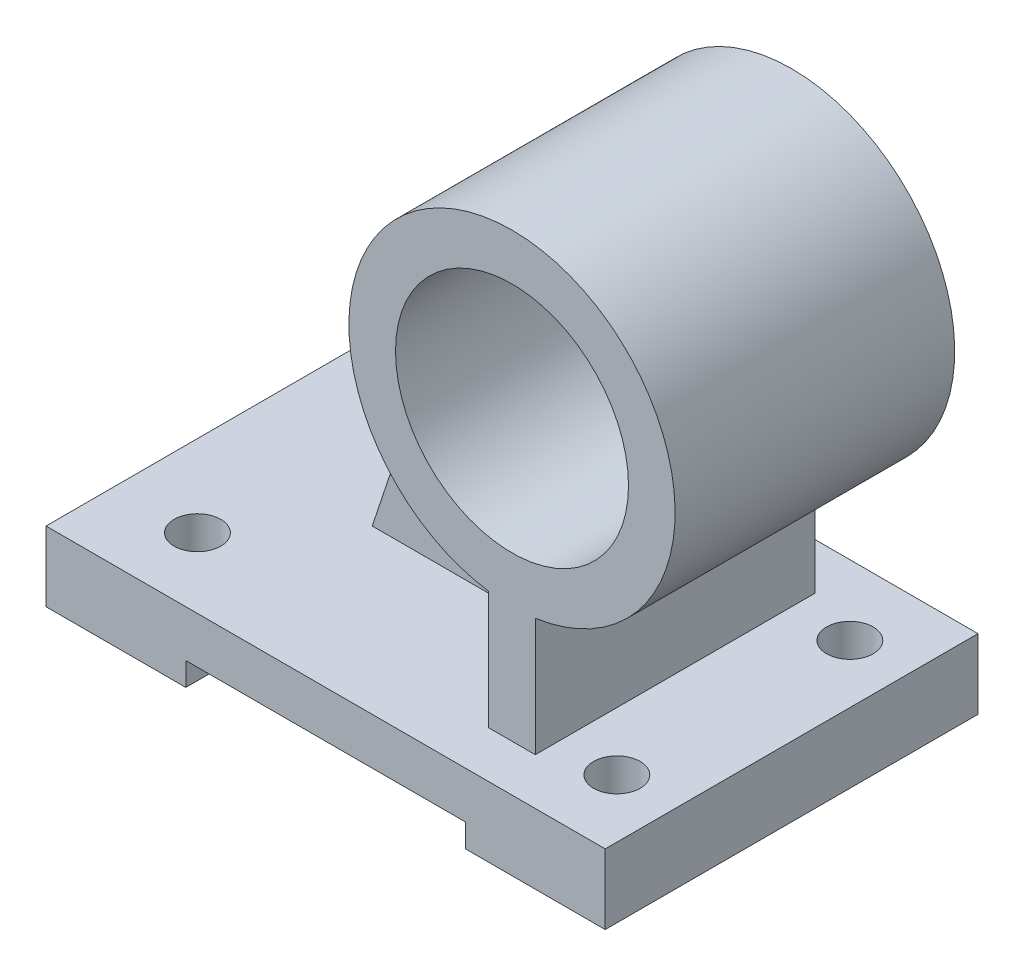
ISO-10303-21;
HEADER;
FILE_DESCRIPTION(('STEP AP214'),'2;1');
FILE_NAME('part.step','',(''),(''),'','','');
FILE_SCHEMA(('AUTOMOTIVE_DESIGN { 1 0 10303 214 1 1 1 1 }'));
ENDSEC;
DATA;
#1=APPLICATION_CONTEXT('core data for automotive mechanical design processes');
#2=APPLICATION_PROTOCOL_DEFINITION('international standard','automotive_design',2000,#1);
#3=PRODUCT_CONTEXT('',#1,'mechanical');
#4=PRODUCT('Part','Part','',(#3));
#5=PRODUCT_RELATED_PRODUCT_CATEGORY('part','',(#4));
#6=PRODUCT_DEFINITION_FORMATION('','',#4);
#7=PRODUCT_DEFINITION_CONTEXT('part definition',#1,'design');
#8=PRODUCT_DEFINITION('design','',#6,#7);
#9=PRODUCT_DEFINITION_SHAPE('','',#8);
#10=(LENGTH_UNIT() NAMED_UNIT(*) SI_UNIT(.MILLI.,.METRE.));
#11=(NAMED_UNIT(*) PLANE_ANGLE_UNIT() SI_UNIT($,.RADIAN.));
#12=(NAMED_UNIT(*) SI_UNIT($,.STERADIAN.) SOLID_ANGLE_UNIT());
#13=UNCERTAINTY_MEASURE_WITH_UNIT(LENGTH_MEASURE(1.E-05),#10,'distance_accuracy_value','');
#14=(GEOMETRIC_REPRESENTATION_CONTEXT(3) GLOBAL_UNCERTAINTY_ASSIGNED_CONTEXT((#13)) GLOBAL_UNIT_ASSIGNED_CONTEXT((#10,
#11,#12)) REPRESENTATION_CONTEXT('',''));
#15=CARTESIAN_POINT('',(0.,0.,0.));
#16=DIRECTION('',(0.,0.,1.));
#17=DIRECTION('',(1.,0.,0.));
#18=AXIS2_PLACEMENT_3D('',#15,#16,#17);
#19=CARTESIAN_POINT('',(0.,0.,-30.));
#20=DIRECTION('',(0.,0.,1.));
#21=DIRECTION('',(1.,0.,0.));
#22=AXIS2_PLACEMENT_3D('',#19,#20,#21);
#23=CYLINDRICAL_SURFACE('',#22,35.);
#24=DIRECTION('',(0.,0.,1.));
#25=VECTOR('',#24,1.);
#26=CARTESIAN_POINT('',(-4.99999999999999,-34.6410161513776,-30.));
#27=LINE('',#26,#25);
#28=CARTESIAN_POINT('',(-4.99999999999999,-34.6410161513776,-30.));
#29=VERTEX_POINT('',#28);
#30=CARTESIAN_POINT('',(-4.99999999999999,-34.6410161513776,-5.));
#31=VERTEX_POINT('',#30);
#32=EDGE_CURVE('E288',#29,#31,#27,.T.);
#33=ORIENTED_EDGE('',*,*,#32,.T.);
#34=CARTESIAN_POINT('',(0.,0.,-5.));
#35=DIRECTION('',(0.,0.,1.));
#36=DIRECTION('',(1.,0.,0.));
#37=AXIS2_PLACEMENT_3D('',#34,#35,#36);
#38=CIRCLE('',#37,35.);
#39=CARTESIAN_POINT('',(-35.,0.,-5.));
#40=VERTEX_POINT('',#39);
#41=EDGE_CURVE('E239',#40,#31,#38,.T.);
#42=ORIENTED_EDGE('',*,*,#41,.F.);
#43=DIRECTION('',(0.,0.,1.));
#44=VECTOR('',#43,1.);
#45=CARTESIAN_POINT('',(-35.,0.,-5.));
#46=LINE('',#45,#44);
#47=CARTESIAN_POINT('',(-35.,0.,5.));
#48=VERTEX_POINT('',#47);
#49=EDGE_CURVE('E249',#40,#48,#46,.T.);
#50=ORIENTED_EDGE('',*,*,#49,.T.);
#51=CARTESIAN_POINT('',(0.,0.,5.));
#52=DIRECTION('',(0.,0.,1.));
#53=DIRECTION('',(1.,0.,0.));
#54=AXIS2_PLACEMENT_3D('',#51,#52,#53);
#55=CIRCLE('',#54,35.);
#56=CARTESIAN_POINT('',(-4.99999999999999,-34.6410161513776,5.));
#57=VERTEX_POINT('',#56);
#58=EDGE_CURVE('E220',#48,#57,#55,.T.);
#59=ORIENTED_EDGE('',*,*,#58,.T.);
#60=CARTESIAN_POINT('',(-4.99999999999999,-34.6410161513776,30.));
#61=VERTEX_POINT('',#60);
#62=EDGE_CURVE('E280',#57,#61,#27,.T.);
#63=ORIENTED_EDGE('',*,*,#62,.T.);
#64=CARTESIAN_POINT('',(0.,0.,30.));
#65=DIRECTION('',(0.,0.,1.));
#66=DIRECTION('',(1.,0.,0.));
#67=AXIS2_PLACEMENT_3D('',#64,#65,#66);
#68=CIRCLE('',#67,35.);
#69=CARTESIAN_POINT('',(5.00000000000001,-34.6410161513776,30.));
#70=VERTEX_POINT('',#69);
#71=EDGE_CURVE('E257',#70,#61,#68,.T.);
#72=ORIENTED_EDGE('',*,*,#71,.F.);
#73=DIRECTION('',(0.,0.,1.));
#74=VECTOR('',#73,1.);
#75=CARTESIAN_POINT('',(5.00000000000001,-34.6410161513776,-30.));
#76=LINE('',#75,#74);
#77=CARTESIAN_POINT('',(5.00000000000001,-34.6410161513776,-30.));
#78=VERTEX_POINT('',#77);
#79=EDGE_CURVE('E11',#78,#70,#76,.T.);
#80=ORIENTED_EDGE('',*,*,#79,.F.);
#81=CARTESIAN_POINT('',(0.,0.,-30.));
#82=DIRECTION('',(0.,0.,1.));
#83=DIRECTION('',(1.,0.,0.));
#84=AXIS2_PLACEMENT_3D('',#81,#82,#83);
#85=CIRCLE('',#84,35.);
#86=EDGE_CURVE('E271',#78,#29,#85,.T.);
#87=ORIENTED_EDGE('',*,*,#86,.T.);
#88=EDGE_LOOP('',(#33,#42,#50,#59,#63,#72,#80,#87));
#89=FACE_BOUND('',#88,.T.);
#90=ADVANCED_FACE('F39',(#89),#23,.T.);
#91=CARTESIAN_POINT('',(-4.99999999999999,0.,-30.));
#92=DIRECTION('',(1.,0.,0.));
#93=DIRECTION('',(0.,1.,0.));
#94=AXIS2_PLACEMENT_3D('',#91,#92,#93);
#95=PLANE('',#94);
#96=DIRECTION('',(0.,1.,0.));
#97=VECTOR('',#96,1.);
#98=CARTESIAN_POINT('',(-4.99999999999999,0.,-5.));
#99=LINE('',#98,#97);
#100=CARTESIAN_POINT('',(-4.99999999999999,-60.,-5.));
#101=VERTEX_POINT('',#100);
#102=EDGE_CURVE('E246',#101,#31,#99,.T.);
#103=ORIENTED_EDGE('',*,*,#102,.T.);
#104=ORIENTED_EDGE('',*,*,#32,.F.);
#105=DIRECTION('',(0.,1.,0.));
#106=VECTOR('',#105,1.);
#107=CARTESIAN_POINT('',(-4.99999999999999,0.,-30.));
#108=LINE('',#107,#106);
#109=CARTESIAN_POINT('',(-4.99999999999999,-60.,-30.));
#110=VERTEX_POINT('',#109);
#111=EDGE_CURVE('E273',#110,#29,#108,.T.);
#112=ORIENTED_EDGE('',*,*,#111,.F.);
#113=DIRECTION('',(0.,0.,1.));
#114=VECTOR('',#113,1.);
#115=CARTESIAN_POINT('',(-4.99999999999999,-60.,-30.));
#116=LINE('',#115,#114);
#117=EDGE_CURVE('E284',#110,#101,#116,.T.);
#118=ORIENTED_EDGE('',*,*,#117,.T.);
#119=EDGE_LOOP('',(#103,#104,#112,#118));
#120=FACE_BOUND('',#119,.T.);
#121=ADVANCED_FACE('F341',(#120),#95,.F.);
#122=CARTESIAN_POINT('',(5.00000000000001,0.,-30.));
#123=DIRECTION('',(1.,0.,0.));
#124=DIRECTION('',(0.,1.,0.));
#125=AXIS2_PLACEMENT_3D('',#122,#123,#124);
#126=PLANE('',#125);
#127=ORIENTED_EDGE('',*,*,#79,.T.);
#128=DIRECTION('',(0.,1.,0.));
#129=VECTOR('',#128,1.);
#130=CARTESIAN_POINT('',(5.00000000000001,0.,30.));
#131=LINE('',#130,#129);
#132=CARTESIAN_POINT('',(5.00000000000001,-60.,30.));
#133=VERTEX_POINT('',#132);
#134=EDGE_CURVE('E265',#133,#70,#131,.T.);
#135=ORIENTED_EDGE('',*,*,#134,.F.);
#136=DIRECTION('',(0.,0.,1.));
#137=VECTOR('',#136,1.);
#138=CARTESIAN_POINT('',(5.00000000000001,-60.,-30.));
#139=LINE('',#138,#137);
#140=CARTESIAN_POINT('',(5.00000000000001,-60.,-30.));
#141=VERTEX_POINT('',#140);
#142=EDGE_CURVE('E48',#141,#133,#139,.T.);
#143=ORIENTED_EDGE('',*,*,#142,.F.);
#144=DIRECTION('',(0.,1.,0.));
#145=VECTOR('',#144,1.);
#146=CARTESIAN_POINT('',(5.00000000000001,0.,-30.));
#147=LINE('',#146,#145);
#148=EDGE_CURVE('E278',#141,#78,#147,.T.);
#149=ORIENTED_EDGE('',*,*,#148,.T.);
#150=EDGE_LOOP('',(#127,#135,#143,#149));
#151=FACE_BOUND('',#150,.T.);
#152=ADVANCED_FACE('F346',(#151),#126,.T.);
#153=CARTESIAN_POINT('',(0.,0.,-30.));
#154=DIRECTION('',(0.,0.,1.));
#155=DIRECTION('',(1.,0.,0.));
#156=AXIS2_PLACEMENT_3D('',#153,#154,#155);
#157=CYLINDRICAL_SURFACE('',#156,25.);
#158=CARTESIAN_POINT('',(0.,0.,-30.));
#159=DIRECTION('',(0.,0.,1.));
#160=DIRECTION('',(1.,0.,0.));
#161=AXIS2_PLACEMENT_3D('',#158,#159,#160);
#162=CIRCLE('',#161,25.);
#163=CARTESIAN_POINT('',(25.,0.,-30.));
#164=VERTEX_POINT('',#163);
#165=EDGE_CURVE('E268',#164,#164,#162,.T.);
#166=ORIENTED_EDGE('',*,*,#165,.F.);
#167=EDGE_LOOP('',(#166));
#168=FACE_BOUND('',#167,.T.);
#169=CARTESIAN_POINT('',(0.,0.,30.));
#170=DIRECTION('',(0.,0.,1.));
#171=DIRECTION('',(1.,0.,0.));
#172=AXIS2_PLACEMENT_3D('',#169,#170,#171);
#173=CIRCLE('',#172,25.);
#174=CARTESIAN_POINT('',(25.,0.,30.));
#175=VERTEX_POINT('',#174);
#176=EDGE_CURVE('E252',#175,#175,#173,.T.);
#177=ORIENTED_EDGE('',*,*,#176,.T.);
#178=EDGE_LOOP('',(#177));
#179=FACE_BOUND('',#178,.T.);
#180=ADVANCED_FACE('F41',(#168,#179),#157,.F.);
#181=ORIENTED_EDGE('',*,*,#62,.F.);
#182=DIRECTION('',(0.,1.,0.));
#183=VECTOR('',#182,1.);
#184=CARTESIAN_POINT('',(-4.99999999999999,0.,5.));
#185=LINE('',#184,#183);
#186=CARTESIAN_POINT('',(-4.99999999999999,-60.,5.));
#187=VERTEX_POINT('',#186);
#188=EDGE_CURVE('E237',#187,#57,#185,.T.);
#189=ORIENTED_EDGE('',*,*,#188,.F.);
#190=CARTESIAN_POINT('',(-4.99999999999999,-60.,30.));
#191=VERTEX_POINT('',#190);
#192=EDGE_CURVE('E287',#187,#191,#116,.T.);
#193=ORIENTED_EDGE('',*,*,#192,.T.);
#194=DIRECTION('',(0.,1.,0.));
#195=VECTOR('',#194,1.);
#196=CARTESIAN_POINT('',(-4.99999999999999,0.,30.));
#197=LINE('',#196,#195);
#198=EDGE_CURVE('E260',#191,#61,#197,.T.);
#199=ORIENTED_EDGE('',*,*,#198,.T.);
#200=EDGE_LOOP('',(#181,#189,#193,#199));
#201=FACE_BOUND('',#200,.T.);
#202=ADVANCED_FACE('F349',(#201),#95,.F.);
#203=CARTESIAN_POINT('',(0.,0.,-30.));
#204=DIRECTION('',(0.,0.,1.));
#205=DIRECTION('',(1.,0.,0.));
#206=AXIS2_PLACEMENT_3D('',#203,#204,#205);
#207=PLANE('',#206);
#208=ORIENTED_EDGE('',*,*,#165,.T.);
#209=EDGE_LOOP('',(#208));
#210=FACE_BOUND('',#209,.T.);
#211=ORIENTED_EDGE('',*,*,#86,.F.);
#212=ORIENTED_EDGE('',*,*,#148,.F.);
#213=DIRECTION('',(1.,0.,0.));
#214=VECTOR('',#213,1.);
#215=CARTESIAN_POINT('',(0.,-60.,-30.));
#216=LINE('',#215,#214);
#217=EDGE_CURVE('E275',#110,#141,#216,.T.);
#218=ORIENTED_EDGE('',*,*,#217,.F.);
#219=ORIENTED_EDGE('',*,*,#111,.T.);
#220=EDGE_LOOP('',(#211,#212,#218,#219));
#221=FACE_BOUND('',#220,.T.);
#222=ADVANCED_FACE('F352',(#210,#221),#207,.F.);
#223=CARTESIAN_POINT('',(0.,0.,30.));
#224=DIRECTION('',(0.,0.,1.));
#225=DIRECTION('',(1.,0.,0.));
#226=AXIS2_PLACEMENT_3D('',#223,#224,#225);
#227=PLANE('',#226);
#228=ORIENTED_EDGE('',*,*,#176,.F.);
#229=EDGE_LOOP('',(#228));
#230=FACE_BOUND('',#229,.T.);
#231=ORIENTED_EDGE('',*,*,#71,.T.);
#232=ORIENTED_EDGE('',*,*,#198,.F.);
#233=DIRECTION('',(1.,0.,0.));
#234=VECTOR('',#233,1.);
#235=CARTESIAN_POINT('',(0.,-60.,30.));
#236=LINE('',#235,#234);
#237=EDGE_CURVE('E263',#191,#133,#236,.T.);
#238=ORIENTED_EDGE('',*,*,#237,.T.);
#239=ORIENTED_EDGE('',*,*,#134,.T.);
#240=EDGE_LOOP('',(#231,#232,#238,#239));
#241=FACE_BOUND('',#240,.T.);
#242=ADVANCED_FACE('F359',(#230,#241),#227,.T.);
#243=CARTESIAN_POINT('',(-31.5,10.5,-5.));
#244=DIRECTION('',(-0.948683298050514,0.316227766016838,0.));
#245=DIRECTION('',(-0.316227766016838,-0.948683298050514,0.));
#246=AXIS2_PLACEMENT_3D('',#243,#244,#245);
#247=PLANE('',#246);
#248=DIRECTION('',(0.,0.,1.));
#249=VECTOR('',#248,1.);
#250=CARTESIAN_POINT('',(-55.,-60.,-5.));
#251=LINE('',#250,#249);
#252=CARTESIAN_POINT('',(-55.,-60.,-5.));
#253=VERTEX_POINT('',#252);
#254=CARTESIAN_POINT('',(-55.,-60.,5.));
#255=VERTEX_POINT('',#254);
#256=EDGE_CURVE('E250',#253,#255,#251,.T.);
#257=ORIENTED_EDGE('',*,*,#256,.T.);
#258=DIRECTION('',(-0.316227766016838,-0.948683298050514,0.));
#259=VECTOR('',#258,1.);
#260=CARTESIAN_POINT('',(-31.5,10.5,5.));
#261=LINE('',#260,#259);
#262=EDGE_CURVE('E234',#48,#255,#261,.T.);
#263=ORIENTED_EDGE('',*,*,#262,.F.);
#264=ORIENTED_EDGE('',*,*,#49,.F.);
#265=DIRECTION('',(-0.316227766016838,-0.948683298050514,0.));
#266=VECTOR('',#265,1.);
#267=CARTESIAN_POINT('',(-31.5,10.5,-5.));
#268=LINE('',#267,#266);
#269=EDGE_CURVE('E241',#40,#253,#268,.T.);
#270=ORIENTED_EDGE('',*,*,#269,.T.);
#271=EDGE_LOOP('',(#257,#263,#264,#270));
#272=FACE_BOUND('',#271,.T.);
#273=ADVANCED_FACE('F363',(#272),#247,.T.);
#274=CARTESIAN_POINT('',(0.,0.,-5.));
#275=DIRECTION('',(0.,0.,1.));
#276=DIRECTION('',(1.,0.,0.));
#277=AXIS2_PLACEMENT_3D('',#274,#275,#276);
#278=PLANE('',#277);
#279=ORIENTED_EDGE('',*,*,#41,.T.);
#280=ORIENTED_EDGE('',*,*,#102,.F.);
#281=DIRECTION('',(-1.,0.,0.));
#282=VECTOR('',#281,1.);
#283=CARTESIAN_POINT('',(0.,-60.,-5.));
#284=LINE('',#283,#282);
#285=EDGE_CURVE('E244',#101,#253,#284,.T.);
#286=ORIENTED_EDGE('',*,*,#285,.T.);
#287=ORIENTED_EDGE('',*,*,#269,.F.);
#288=EDGE_LOOP('',(#279,#280,#286,#287));
#289=FACE_BOUND('',#288,.T.);
#290=ADVANCED_FACE('F367',(#289),#278,.F.);
#291=CARTESIAN_POINT('',(0.,0.,5.));
#292=DIRECTION('',(0.,0.,1.));
#293=DIRECTION('',(1.,0.,0.));
#294=AXIS2_PLACEMENT_3D('',#291,#292,#293);
#295=PLANE('',#294);
#296=ORIENTED_EDGE('',*,*,#58,.F.);
#297=ORIENTED_EDGE('',*,*,#262,.T.);
#298=DIRECTION('',(-1.,0.,0.));
#299=VECTOR('',#298,1.);
#300=CARTESIAN_POINT('',(0.,-60.,5.));
#301=LINE('',#300,#299);
#302=EDGE_CURVE('E56',#187,#255,#301,.T.);
#303=ORIENTED_EDGE('',*,*,#302,.F.);
#304=ORIENTED_EDGE('',*,*,#188,.T.);
#305=EDGE_LOOP('',(#296,#297,#303,#304));
#306=FACE_BOUND('',#305,.T.);
#307=ADVANCED_FACE('F371',(#306),#295,.T.);
#308=CARTESIAN_POINT('',(0.,-60.,-40.));
#309=DIRECTION('',(0.,-1.,0.));
#310=DIRECTION('',(0.,0.,-1.));
#311=AXIS2_PLACEMENT_3D('',#308,#309,#310);
#312=PLANE('',#311);
#313=CARTESIAN_POINT('',(17.5000000000005,-60.,25.));
#314=DIRECTION('',(0.,1.,0.));
#315=DIRECTION('',(0.,0.,1.));
#316=AXIS2_PLACEMENT_3D('',#313,#314,#315);
#317=CIRCLE('',#316,5.);
#318=CARTESIAN_POINT('',(17.5000000000005,-60.,30.));
#319=VERTEX_POINT('',#318);
#320=EDGE_CURVE('E389',#319,#319,#317,.T.);
#321=ORIENTED_EDGE('',*,*,#320,.F.);
#322=EDGE_LOOP('',(#321));
#323=FACE_BOUND('',#322,.T.);
#324=CARTESIAN_POINT('',(17.5,-60.,-25.));
#325=DIRECTION('',(0.,1.,0.));
#326=DIRECTION('',(0.,0.,1.));
#327=AXIS2_PLACEMENT_3D('',#324,#325,#326);
#328=CIRCLE('',#327,5.);
#329=CARTESIAN_POINT('',(17.5,-60.,-20.));
#330=VERTEX_POINT('',#329);
#331=EDGE_CURVE('E393',#330,#330,#328,.T.);
#332=ORIENTED_EDGE('',*,*,#331,.F.);
#333=EDGE_LOOP('',(#332));
#334=FACE_BOUND('',#333,.T.);
#335=CARTESIAN_POINT('',(-72.5,-60.,-25.));
#336=DIRECTION('',(0.,1.,0.));
#337=DIRECTION('',(0.,0.,1.));
#338=AXIS2_PLACEMENT_3D('',#335,#336,#337);
#339=CIRCLE('',#338,5.);
#340=CARTESIAN_POINT('',(-72.5,-60.,-20.));
#341=VERTEX_POINT('',#340);
#342=EDGE_CURVE('E397',#341,#341,#339,.T.);
#343=ORIENTED_EDGE('',*,*,#342,.F.);
#344=EDGE_LOOP('',(#343));
#345=FACE_BOUND('',#344,.T.);
#346=CARTESIAN_POINT('',(-72.4999999999995,-60.,25.));
#347=DIRECTION('',(0.,1.,0.));
#348=DIRECTION('',(0.,0.,1.));
#349=AXIS2_PLACEMENT_3D('',#346,#347,#348);
#350=CIRCLE('',#349,5.);
#351=CARTESIAN_POINT('',(-72.4999999999995,-60.,30.));
#352=VERTEX_POINT('',#351);
#353=EDGE_CURVE('E185',#352,#352,#350,.T.);
#354=ORIENTED_EDGE('',*,*,#353,.F.);
#355=EDGE_LOOP('',(#354));
#356=FACE_BOUND('',#355,.T.);
#357=DIRECTION('',(0.,0.,1.));
#358=VECTOR('',#357,1.);
#359=CARTESIAN_POINT('',(-90.,-60.,-40.));
#360=LINE('',#359,#358);
#361=CARTESIAN_POINT('',(-90.,-60.,-40.));
#362=VERTEX_POINT('',#361);
#363=CARTESIAN_POINT('',(-90.,-60.,40.));
#364=VERTEX_POINT('',#363);
#365=EDGE_CURVE('E225',#362,#364,#360,.T.);
#366=ORIENTED_EDGE('',*,*,#365,.T.);
#367=DIRECTION('',(1.,0.,0.));
#368=VECTOR('',#367,1.);
#369=CARTESIAN_POINT('',(0.,-60.,40.));
#370=LINE('',#369,#368);
#371=CARTESIAN_POINT('',(29.9999999999999,-60.,40.));
#372=VERTEX_POINT('',#371);
#373=EDGE_CURVE('E192',#364,#372,#370,.T.);
#374=ORIENTED_EDGE('',*,*,#373,.T.);
#375=DIRECTION('',(0.,0.,1.));
#376=VECTOR('',#375,1.);
#377=CARTESIAN_POINT('',(29.9999999999999,-60.,-40.));
#378=LINE('',#377,#376);
#379=CARTESIAN_POINT('',(29.9999999999999,-60.,-40.));
#380=VERTEX_POINT('',#379);
#381=EDGE_CURVE('E227',#380,#372,#378,.T.);
#382=ORIENTED_EDGE('',*,*,#381,.F.);
#383=DIRECTION('',(1.,0.,0.));
#384=VECTOR('',#383,1.);
#385=CARTESIAN_POINT('',(0.,-60.,-40.));
#386=LINE('',#385,#384);
#387=EDGE_CURVE('E208',#362,#380,#386,.T.);
#388=ORIENTED_EDGE('',*,*,#387,.F.);
#389=EDGE_LOOP('',(#366,#374,#382,#388));
#390=FACE_BOUND('',#389,.T.);
#391=ORIENTED_EDGE('',*,*,#217,.T.);
#392=ORIENTED_EDGE('',*,*,#142,.T.);
#393=ORIENTED_EDGE('',*,*,#237,.F.);
#394=ORIENTED_EDGE('',*,*,#192,.F.);
#395=ORIENTED_EDGE('',*,*,#302,.T.);
#396=ORIENTED_EDGE('',*,*,#256,.F.);
#397=ORIENTED_EDGE('',*,*,#285,.F.);
#398=ORIENTED_EDGE('',*,*,#117,.F.);
#399=EDGE_LOOP('',(#391,#392,#393,#394,#395,#396,#397,#398));
#400=FACE_BOUND('',#399,.T.);
#401=ADVANCED_FACE('F328',(#323,#334,#345,#356,#390,#400),#312,.F.);
#402=CARTESIAN_POINT('',(0.,-70.,-40.));
#403=DIRECTION('',(0.,-1.,0.));
#404=DIRECTION('',(0.,0.,-1.));
#405=AXIS2_PLACEMENT_3D('',#402,#403,#404);
#406=PLANE('',#405);
#407=DIRECTION('',(0.,0.,1.));
#408=VECTOR('',#407,1.);
#409=CARTESIAN_POINT('',(0.,-70.,-40.));
#410=LINE('',#409,#408);
#411=CARTESIAN_POINT('',(0.,-70.,-40.));
#412=VERTEX_POINT('',#411);
#413=CARTESIAN_POINT('',(0.,-70.,40.));
#414=VERTEX_POINT('',#413);
#415=EDGE_CURVE('E154',#412,#414,#410,.T.);
#416=ORIENTED_EDGE('',*,*,#415,.T.);
#417=DIRECTION('',(1.,0.,0.));
#418=VECTOR('',#417,1.);
#419=CARTESIAN_POINT('',(0.,-70.,40.));
#420=LINE('',#419,#418);
#421=CARTESIAN_POINT('',(-60.0000000000001,-70.,40.));
#422=VERTEX_POINT('',#421);
#423=EDGE_CURVE('E158',#422,#414,#420,.T.);
#424=ORIENTED_EDGE('',*,*,#423,.F.);
#425=DIRECTION('',(0.,0.,1.));
#426=VECTOR('',#425,1.);
#427=CARTESIAN_POINT('',(-60.0000000000001,-70.,-40.));
#428=LINE('',#427,#426);
#429=CARTESIAN_POINT('',(-60.0000000000001,-70.,-40.));
#430=VERTEX_POINT('',#429);
#431=EDGE_CURVE('E218',#430,#422,#428,.T.);
#432=ORIENTED_EDGE('',*,*,#431,.F.);
#433=DIRECTION('',(1.,0.,0.));
#434=VECTOR('',#433,1.);
#435=CARTESIAN_POINT('',(0.,-70.,-40.));
#436=LINE('',#435,#434);
#437=EDGE_CURVE('E160',#430,#412,#436,.T.);
#438=ORIENTED_EDGE('',*,*,#437,.T.);
#439=EDGE_LOOP('',(#416,#424,#432,#438));
#440=FACE_BOUND('',#439,.T.);
#441=ADVANCED_FACE('F156',(#440),#406,.T.);
#442=CARTESIAN_POINT('',(-60.0000000000001,0.,-40.));
#443=DIRECTION('',(1.,0.,0.));
#444=DIRECTION('',(0.,0.,-1.));
#445=AXIS2_PLACEMENT_3D('',#442,#443,#444);
#446=PLANE('',#445);
#447=ORIENTED_EDGE('',*,*,#431,.T.);
#448=DIRECTION('',(0.,1.,0.));
#449=VECTOR('',#448,1.);
#450=CARTESIAN_POINT('',(-60.0000000000001,0.,40.));
#451=LINE('',#450,#449);
#452=CARTESIAN_POINT('',(-60.0000000000001,-75.,40.));
#453=VERTEX_POINT('',#452);
#454=EDGE_CURVE('E180',#453,#422,#451,.T.);
#455=ORIENTED_EDGE('',*,*,#454,.F.);
#456=DIRECTION('',(0.,0.,1.));
#457=VECTOR('',#456,1.);
#458=CARTESIAN_POINT('',(-60.0000000000001,-75.,-40.));
#459=LINE('',#458,#457);
#460=CARTESIAN_POINT('',(-60.0000000000001,-75.,-40.));
#461=VERTEX_POINT('',#460);
#462=EDGE_CURVE('E221',#461,#453,#459,.T.);
#463=ORIENTED_EDGE('',*,*,#462,.F.);
#464=DIRECTION('',(0.,1.,0.));
#465=VECTOR('',#464,1.);
#466=CARTESIAN_POINT('',(-60.0000000000001,0.,-40.));
#467=LINE('',#466,#465);
#468=EDGE_CURVE('E165',#461,#430,#467,.T.);
#469=ORIENTED_EDGE('',*,*,#468,.T.);
#470=EDGE_LOOP('',(#447,#455,#463,#469));
#471=FACE_BOUND('',#470,.T.);
#472=ADVANCED_FACE('F306',(#471),#446,.T.);
#473=CARTESIAN_POINT('',(0.,-75.,-40.));
#474=DIRECTION('',(0.,-1.,0.));
#475=DIRECTION('',(1.,0.,0.));
#476=AXIS2_PLACEMENT_3D('',#473,#474,#475);
#477=PLANE('',#476);
#478=CARTESIAN_POINT('',(-72.5,-75.,-25.));
#479=DIRECTION('',(0.,-1.,0.));
#480=DIRECTION('',(1.,0.,0.));
#481=AXIS2_PLACEMENT_3D('',#478,#479,#480);
#482=CIRCLE('',#481,5.);
#483=CARTESIAN_POINT('',(-67.5,-75.,-25.));
#484=VERTEX_POINT('',#483);
#485=EDGE_CURVE('E43',#484,#484,#482,.T.);
#486=ORIENTED_EDGE('',*,*,#485,.F.);
#487=EDGE_LOOP('',(#486));
#488=FACE_BOUND('',#487,.T.);
#489=CARTESIAN_POINT('',(-72.4999999999995,-75.,25.));
#490=DIRECTION('',(0.,-1.,0.));
#491=DIRECTION('',(1.,0.,0.));
#492=AXIS2_PLACEMENT_3D('',#489,#490,#491);
#493=CIRCLE('',#492,5.);
#494=CARTESIAN_POINT('',(-67.4999999999995,-75.,25.));
#495=VERTEX_POINT('',#494);
#496=EDGE_CURVE('E183',#495,#495,#493,.T.);
#497=ORIENTED_EDGE('',*,*,#496,.F.);
#498=EDGE_LOOP('',(#497));
#499=FACE_BOUND('',#498,.T.);
#500=ORIENTED_EDGE('',*,*,#462,.T.);
#501=DIRECTION('',(1.,0.,0.));
#502=VECTOR('',#501,1.);
#503=CARTESIAN_POINT('',(0.,-75.,40.));
#504=LINE('',#503,#502);
#505=CARTESIAN_POINT('',(-90.,-75.,40.));
#506=VERTEX_POINT('',#505);
#507=EDGE_CURVE('E198',#506,#453,#504,.T.);
#508=ORIENTED_EDGE('',*,*,#507,.F.);
#509=DIRECTION('',(0.,0.,1.));
#510=VECTOR('',#509,1.);
#511=CARTESIAN_POINT('',(-90.,-75.,-40.));
#512=LINE('',#511,#510);
#513=CARTESIAN_POINT('',(-90.,-75.,-40.));
#514=VERTEX_POINT('',#513);
#515=EDGE_CURVE('E223',#514,#506,#512,.T.);
#516=ORIENTED_EDGE('',*,*,#515,.F.);
#517=DIRECTION('',(1.,0.,0.));
#518=VECTOR('',#517,1.);
#519=CARTESIAN_POINT('',(0.,-75.,-40.));
#520=LINE('',#519,#518);
#521=EDGE_CURVE('E213',#514,#461,#520,.T.);
#522=ORIENTED_EDGE('',*,*,#521,.T.);
#523=EDGE_LOOP('',(#500,#508,#516,#522));
#524=FACE_BOUND('',#523,.T.);
#525=ADVANCED_FACE('F302',(#488,#499,#524),#477,.T.);
#526=CARTESIAN_POINT('',(-89.9999999999999,0.,-40.));
#527=DIRECTION('',(-1.,0.,0.));
#528=DIRECTION('',(0.,-1.,0.));
#529=AXIS2_PLACEMENT_3D('',#526,#527,#528);
#530=PLANE('',#529);
#531=ORIENTED_EDGE('',*,*,#515,.T.);
#532=DIRECTION('',(0.,-1.,0.));
#533=VECTOR('',#532,1.);
#534=CARTESIAN_POINT('',(-89.9999999999999,0.,40.));
#535=LINE('',#534,#533);
#536=EDGE_CURVE('E195',#364,#506,#535,.T.);
#537=ORIENTED_EDGE('',*,*,#536,.F.);
#538=ORIENTED_EDGE('',*,*,#365,.F.);
#539=DIRECTION('',(0.,-1.,0.));
#540=VECTOR('',#539,1.);
#541=CARTESIAN_POINT('',(-89.9999999999999,0.,-40.));
#542=LINE('',#541,#540);
#543=EDGE_CURVE('E210',#362,#514,#542,.T.);
#544=ORIENTED_EDGE('',*,*,#543,.T.);
#545=EDGE_LOOP('',(#531,#537,#538,#544));
#546=FACE_BOUND('',#545,.T.);
#547=ADVANCED_FACE('F305',(#546),#530,.T.);
#548=CARTESIAN_POINT('',(29.9999999999999,0.,-40.));
#549=DIRECTION('',(-1.,0.,0.));
#550=DIRECTION('',(0.,-1.,0.));
#551=AXIS2_PLACEMENT_3D('',#548,#549,#550);
#552=PLANE('',#551);
#553=ORIENTED_EDGE('',*,*,#381,.T.);
#554=DIRECTION('',(0.,-1.,0.));
#555=VECTOR('',#554,1.);
#556=CARTESIAN_POINT('',(29.9999999999999,0.,40.));
#557=LINE('',#556,#555);
#558=CARTESIAN_POINT('',(30.,-75.,40.));
#559=VERTEX_POINT('',#558);
#560=EDGE_CURVE('E189',#372,#559,#557,.T.);
#561=ORIENTED_EDGE('',*,*,#560,.T.);
#562=DIRECTION('',(0.,0.,1.));
#563=VECTOR('',#562,1.);
#564=CARTESIAN_POINT('',(30.,-75.,-40.));
#565=LINE('',#564,#563);
#566=CARTESIAN_POINT('',(30.,-75.,-40.));
#567=VERTEX_POINT('',#566);
#568=EDGE_CURVE('E229',#567,#559,#565,.T.);
#569=ORIENTED_EDGE('',*,*,#568,.F.);
#570=DIRECTION('',(0.,-1.,0.));
#571=VECTOR('',#570,1.);
#572=CARTESIAN_POINT('',(29.9999999999999,0.,-40.));
#573=LINE('',#572,#571);
#574=EDGE_CURVE('E206',#380,#567,#573,.T.);
#575=ORIENTED_EDGE('',*,*,#574,.F.);
#576=EDGE_LOOP('',(#553,#561,#569,#575));
#577=FACE_BOUND('',#576,.T.);
#578=ADVANCED_FACE('F324',(#577),#552,.F.);
#579=CARTESIAN_POINT('',(0.,-75.,-40.));
#580=DIRECTION('',(0.,1.,0.));
#581=DIRECTION('',(0.,0.,1.));
#582=AXIS2_PLACEMENT_3D('',#579,#580,#581);
#583=PLANE('',#582);
#584=CARTESIAN_POINT('',(17.5000000000005,-75.,25.));
#585=DIRECTION('',(0.,1.,0.));
#586=DIRECTION('',(0.,0.,1.));
#587=AXIS2_PLACEMENT_3D('',#584,#585,#586);
#588=CIRCLE('',#587,5.);
#589=CARTESIAN_POINT('',(17.5000000000005,-75.,30.));
#590=VERTEX_POINT('',#589);
#591=EDGE_CURVE('E294',#590,#590,#588,.T.);
#592=ORIENTED_EDGE('',*,*,#591,.T.);
#593=EDGE_LOOP('',(#592));
#594=FACE_BOUND('',#593,.T.);
#595=CARTESIAN_POINT('',(17.5,-75.,-25.));
#596=DIRECTION('',(0.,1.,0.));
#597=DIRECTION('',(0.,0.,1.));
#598=AXIS2_PLACEMENT_3D('',#595,#596,#597);
#599=CIRCLE('',#598,5.);
#600=CARTESIAN_POINT('',(17.5,-75.,-20.));
#601=VERTEX_POINT('',#600);
#602=EDGE_CURVE('E291',#601,#601,#599,.T.);
#603=ORIENTED_EDGE('',*,*,#602,.T.);
#604=EDGE_LOOP('',(#603));
#605=FACE_BOUND('',#604,.T.);
#606=ORIENTED_EDGE('',*,*,#568,.T.);
#607=DIRECTION('',(-1.,0.,0.));
#608=VECTOR('',#607,1.);
#609=CARTESIAN_POINT('',(0.,-75.,40.));
#610=LINE('',#609,#608);
#611=CARTESIAN_POINT('',(0.,-75.,40.));
#612=VERTEX_POINT('',#611);
#613=EDGE_CURVE('E174',#559,#612,#610,.T.);
#614=ORIENTED_EDGE('',*,*,#613,.T.);
#615=DIRECTION('',(0.,0.,1.));
#616=VECTOR('',#615,1.);
#617=CARTESIAN_POINT('',(0.,-75.,-40.));
#618=LINE('',#617,#616);
#619=CARTESIAN_POINT('',(0.,-75.,-40.));
#620=VERTEX_POINT('',#619);
#621=EDGE_CURVE('E164',#620,#612,#618,.T.);
#622=ORIENTED_EDGE('',*,*,#621,.F.);
#623=DIRECTION('',(-1.,0.,0.));
#624=VECTOR('',#623,1.);
#625=CARTESIAN_POINT('',(0.,-75.,-40.));
#626=LINE('',#625,#624);
#627=EDGE_CURVE('E204',#567,#620,#626,.T.);
#628=ORIENTED_EDGE('',*,*,#627,.F.);
#629=EDGE_LOOP('',(#606,#614,#622,#628));
#630=FACE_BOUND('',#629,.T.);
#631=ADVANCED_FACE('F321',(#594,#605,#630),#583,.F.);
#632=CARTESIAN_POINT('',(0.,0.,-40.));
#633=DIRECTION('',(-1.,0.,0.));
#634=DIRECTION('',(0.,-1.,0.));
#635=AXIS2_PLACEMENT_3D('',#632,#633,#634);
#636=PLANE('',#635);
#637=ORIENTED_EDGE('',*,*,#621,.T.);
#638=DIRECTION('',(0.,-1.,0.));
#639=VECTOR('',#638,1.);
#640=CARTESIAN_POINT('',(0.,0.,40.));
#641=LINE('',#640,#639);
#642=EDGE_CURVE('E168',#414,#612,#641,.T.);
#643=ORIENTED_EDGE('',*,*,#642,.F.);
#644=ORIENTED_EDGE('',*,*,#415,.F.);
#645=DIRECTION('',(0.,-1.,0.));
#646=VECTOR('',#645,1.);
#647=CARTESIAN_POINT('',(0.,0.,-40.));
#648=LINE('',#647,#646);
#649=EDGE_CURVE('E202',#412,#620,#648,.T.);
#650=ORIENTED_EDGE('',*,*,#649,.T.);
#651=EDGE_LOOP('',(#637,#643,#644,#650));
#652=FACE_BOUND('',#651,.T.);
#653=ADVANCED_FACE('F169',(#652),#636,.T.);
#654=CARTESIAN_POINT('',(0.,0.,-40.));
#655=DIRECTION('',(0.,0.,1.));
#656=DIRECTION('',(1.,0.,0.));
#657=AXIS2_PLACEMENT_3D('',#654,#655,#656);
#658=PLANE('',#657);
#659=ORIENTED_EDGE('',*,*,#437,.F.);
#660=ORIENTED_EDGE('',*,*,#468,.F.);
#661=ORIENTED_EDGE('',*,*,#521,.F.);
#662=ORIENTED_EDGE('',*,*,#543,.F.);
#663=ORIENTED_EDGE('',*,*,#387,.T.);
#664=ORIENTED_EDGE('',*,*,#574,.T.);
#665=ORIENTED_EDGE('',*,*,#627,.T.);
#666=ORIENTED_EDGE('',*,*,#649,.F.);
#667=EDGE_LOOP('',(#659,#660,#661,#662,#663,#664,#665,#666));
#668=FACE_BOUND('',#667,.T.);
#669=ADVANCED_FACE('F316',(#668),#658,.F.);
#670=CARTESIAN_POINT('',(0.,0.,40.));
#671=DIRECTION('',(0.,0.,1.));
#672=DIRECTION('',(1.,0.,0.));
#673=AXIS2_PLACEMENT_3D('',#670,#671,#672);
#674=PLANE('',#673);
#675=ORIENTED_EDGE('',*,*,#423,.T.);
#676=ORIENTED_EDGE('',*,*,#642,.T.);
#677=ORIENTED_EDGE('',*,*,#613,.F.);
#678=ORIENTED_EDGE('',*,*,#560,.F.);
#679=ORIENTED_EDGE('',*,*,#373,.F.);
#680=ORIENTED_EDGE('',*,*,#536,.T.);
#681=ORIENTED_EDGE('',*,*,#507,.T.);
#682=ORIENTED_EDGE('',*,*,#454,.T.);
#683=EDGE_LOOP('',(#675,#676,#677,#678,#679,#680,#681,#682));
#684=FACE_BOUND('',#683,.T.);
#685=ADVANCED_FACE('F177',(#684),#674,.T.);
#686=CARTESIAN_POINT('',(17.5,-100.,-25.));
#687=DIRECTION('',(0.,1.,0.));
#688=DIRECTION('',(0.,0.,1.));
#689=AXIS2_PLACEMENT_3D('',#686,#687,#688);
#690=CYLINDRICAL_SURFACE('',#689,5.);
#691=ORIENTED_EDGE('',*,*,#331,.T.);
#692=EDGE_LOOP('',(#691));
#693=FACE_BOUND('',#692,.T.);
#694=ORIENTED_EDGE('',*,*,#602,.F.);
#695=EDGE_LOOP('',(#694));
#696=FACE_BOUND('',#695,.T.);
#697=ADVANCED_FACE('F407',(#693,#696),#690,.F.);
#698=CARTESIAN_POINT('',(17.5000000000005,-100.,25.));
#699=DIRECTION('',(0.,1.,0.));
#700=DIRECTION('',(0.,0.,1.));
#701=AXIS2_PLACEMENT_3D('',#698,#699,#700);
#702=CYLINDRICAL_SURFACE('',#701,5.);
#703=ORIENTED_EDGE('',*,*,#320,.T.);
#704=EDGE_LOOP('',(#703));
#705=FACE_BOUND('',#704,.T.);
#706=ORIENTED_EDGE('',*,*,#591,.F.);
#707=EDGE_LOOP('',(#706));
#708=FACE_BOUND('',#707,.T.);
#709=ADVANCED_FACE('F404',(#705,#708),#702,.F.);
#710=CARTESIAN_POINT('',(-72.4999999999995,-100.,25.));
#711=DIRECTION('',(0.,1.,0.));
#712=DIRECTION('',(0.,0.,1.));
#713=AXIS2_PLACEMENT_3D('',#710,#711,#712);
#714=CYLINDRICAL_SURFACE('',#713,5.);
#715=ORIENTED_EDGE('',*,*,#496,.T.);
#716=EDGE_LOOP('',(#715));
#717=FACE_BOUND('',#716,.T.);
#718=ORIENTED_EDGE('',*,*,#353,.T.);
#719=EDGE_LOOP('',(#718));
#720=FACE_BOUND('',#719,.T.);
#721=ADVANCED_FACE('F299',(#717,#720),#714,.F.);
#722=CARTESIAN_POINT('',(-72.5,-100.,-25.));
#723=DIRECTION('',(0.,1.,0.));
#724=DIRECTION('',(0.,0.,1.));
#725=AXIS2_PLACEMENT_3D('',#722,#723,#724);
#726=CYLINDRICAL_SURFACE('',#725,5.);
#727=ORIENTED_EDGE('',*,*,#485,.T.);
#728=EDGE_LOOP('',(#727));
#729=FACE_BOUND('',#728,.T.);
#730=ORIENTED_EDGE('',*,*,#342,.T.);
#731=EDGE_LOOP('',(#730));
#732=FACE_BOUND('',#731,.T.);
#733=ADVANCED_FACE('F420',(#729,#732),#726,.F.);
#734=CLOSED_SHELL('',(#90,#121,#152,#180,#202,#222,#242,#273,#290,#307,#401,#441,#472,#525,#547,
#578,#631,#653,#669,#685,#697,#709,#721,#733));
#735=MANIFOLD_SOLID_BREP('B2',#734);
#736=ADVANCED_BREP_SHAPE_REPRESENTATION('',(#18,#735),#14);
#737=SHAPE_DEFINITION_REPRESENTATION(#9,#736);
ENDSEC;
END-ISO-10303-21;
